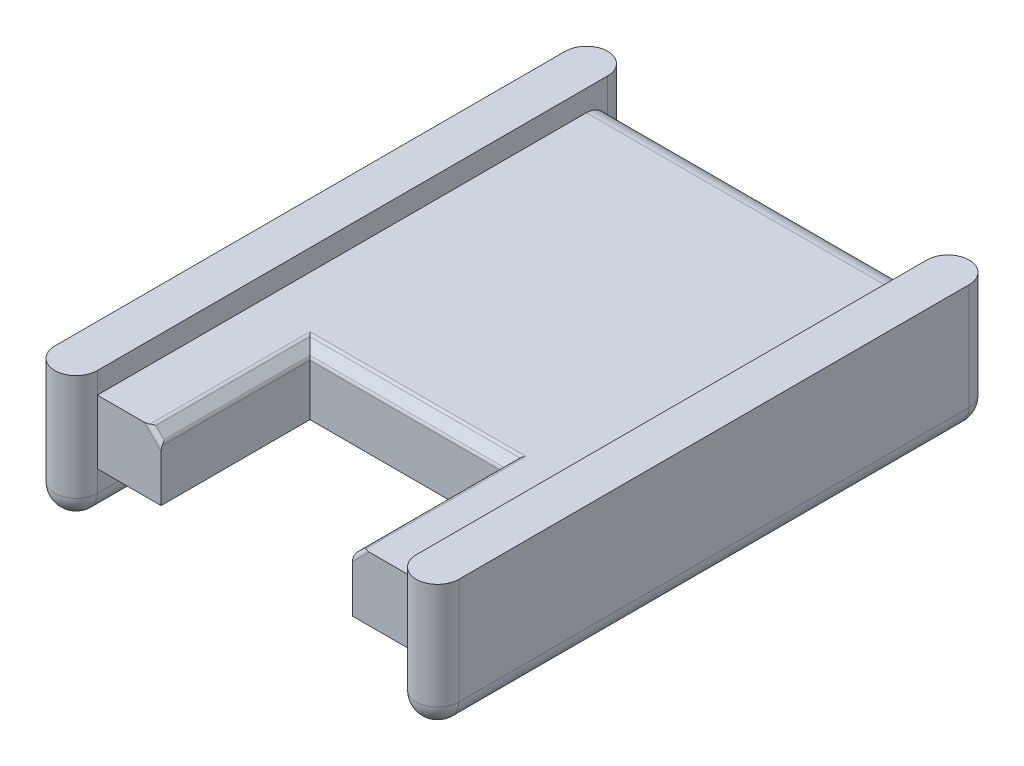
ISO-10303-21;
HEADER;
FILE_DESCRIPTION(('STEP AP214'),'2;1');
FILE_NAME('part.step','',(''),(''),'','','');
FILE_SCHEMA(('AUTOMOTIVE_DESIGN { 1 0 10303 214 1 1 1 1 }'));
ENDSEC;
DATA;
#1=APPLICATION_CONTEXT('core data for automotive mechanical design processes');
#2=APPLICATION_PROTOCOL_DEFINITION('international standard','automotive_design',2000,#1);
#3=PRODUCT_CONTEXT('',#1,'mechanical');
#4=PRODUCT('Part','Part','',(#3));
#5=PRODUCT_RELATED_PRODUCT_CATEGORY('part','',(#4));
#6=PRODUCT_DEFINITION_FORMATION('','',#4);
#7=PRODUCT_DEFINITION_CONTEXT('part definition',#1,'design');
#8=PRODUCT_DEFINITION('design','',#6,#7);
#9=PRODUCT_DEFINITION_SHAPE('','',#8);
#10=(LENGTH_UNIT() NAMED_UNIT(*) SI_UNIT(.MILLI.,.METRE.));
#11=(NAMED_UNIT(*) PLANE_ANGLE_UNIT() SI_UNIT($,.RADIAN.));
#12=(NAMED_UNIT(*) SI_UNIT($,.STERADIAN.) SOLID_ANGLE_UNIT());
#13=UNCERTAINTY_MEASURE_WITH_UNIT(LENGTH_MEASURE(1.E-05),#10,'distance_accuracy_value','');
#14=(GEOMETRIC_REPRESENTATION_CONTEXT(3) GLOBAL_UNCERTAINTY_ASSIGNED_CONTEXT((#13)) GLOBAL_UNIT_ASSIGNED_CONTEXT((#10,
#11,#12)) REPRESENTATION_CONTEXT('',''));
#15=CARTESIAN_POINT('',(0.,0.,0.));
#16=DIRECTION('',(0.,0.,1.));
#17=DIRECTION('',(1.,0.,0.));
#18=AXIS2_PLACEMENT_3D('',#15,#16,#17);
#19=CARTESIAN_POINT('',(0.,0.,0.));
#20=DIRECTION('',(0.,0.,-1.));
#21=DIRECTION('',(-1.,0.,0.));
#22=AXIS2_PLACEMENT_3D('',#19,#20,#21);
#23=PLANE('',#22);
#24=DIRECTION('',(-1.,0.,0.));
#25=VECTOR('',#24,1.);
#26=CARTESIAN_POINT('',(0.,150.,0.));
#27=LINE('',#26,#25);
#28=CARTESIAN_POINT('',(750.,150.,0.));
#29=VERTEX_POINT('',#28);
#30=CARTESIAN_POINT('',(639.142135623731,150.,0.));
#31=VERTEX_POINT('',#30);
#32=EDGE_CURVE('E405',#29,#31,#27,.T.);
#33=ORIENTED_EDGE('',*,*,#32,.T.);
#34=DIRECTION('',(-0.707106781186551,-0.707106781186544,0.));
#35=VECTOR('',#34,1.);
#36=CARTESIAN_POINT('',(607.071067811866,117.928932188135,0.));
#37=LINE('',#36,#35);
#38=CARTESIAN_POINT('',(600.,110.857864376269,0.));
#39=VERTEX_POINT('',#38);
#40=EDGE_CURVE('E303',#31,#39,#37,.T.);
#41=ORIENTED_EDGE('',*,*,#40,.T.);
#42=DIRECTION('',(0.,-1.,0.));
#43=VECTOR('',#42,1.);
#44=CARTESIAN_POINT('',(600.,0.,0.));
#45=LINE('',#44,#43);
#46=CARTESIAN_POINT('',(600.,0.,1.11022302462516E-13));
#47=VERTEX_POINT('',#46);
#48=EDGE_CURVE('E255',#39,#47,#45,.T.);
#49=ORIENTED_EDGE('',*,*,#48,.T.);
#50=DIRECTION('',(1.,0.,0.));
#51=VECTOR('',#50,1.);
#52=CARTESIAN_POINT('',(0.,0.,0.));
#53=LINE('',#52,#51);
#54=CARTESIAN_POINT('',(750.,0.,0.));
#55=VERTEX_POINT('',#54);
#56=EDGE_CURVE('E547',#47,#55,#53,.T.);
#57=ORIENTED_EDGE('',*,*,#56,.T.);
#58=DIRECTION('',(0.,1.,0.));
#59=VECTOR('',#58,1.);
#60=CARTESIAN_POINT('',(750.,0.,0.));
#61=LINE('',#60,#59);
#62=EDGE_CURVE('E410',#55,#29,#61,.T.);
#63=ORIENTED_EDGE('',*,*,#62,.T.);
#64=EDGE_LOOP('',(#33,#41,#49,#57,#63));
#65=FACE_BOUND('',#64,.T.);
#66=ADVANCED_FACE('F39',(#65),#23,.F.);
#67=CARTESIAN_POINT('',(0.,150.,-1200.));
#68=DIRECTION('',(0.,1.,0.));
#69=DIRECTION('',(0.,0.,1.));
#70=AXIS2_PLACEMENT_3D('',#67,#68,#69);
#71=PLANE('',#70);
#72=CARTESIAN_POINT('',(110.857864376269,150.,0.));
#73=VERTEX_POINT('',#72);
#74=CARTESIAN_POINT('',(0.,150.,0.));
#75=VERTEX_POINT('',#74);
#76=EDGE_CURVE('E395',#73,#75,#27,.T.);
#77=ORIENTED_EDGE('',*,*,#76,.F.);
#78=CARTESIAN_POINT('',(110.857864376269,150.,-10.));
#79=DIRECTION('',(0.,1.,0.));
#80=DIRECTION('',(1.,0.,0.));
#81=AXIS2_PLACEMENT_3D('',#78,#79,#80);
#82=ELLIPSE('',#81,14.142135623731,10.);
#83=CARTESIAN_POINT('',(120.857864376269,150.,-2.9289321881345));
#84=VERTEX_POINT('',#83);
#85=EDGE_CURVE('E284',#73,#84,#82,.T.);
#86=ORIENTED_EDGE('',*,*,#85,.T.);
#87=DIRECTION('',(0.,0.,-1.));
#88=VECTOR('',#87,1.);
#89=CARTESIAN_POINT('',(120.857864376269,150.,-1200.));
#90=LINE('',#89,#88);
#91=CARTESIAN_POINT('',(120.857864376269,150.,-379.142135623731));
#92=VERTEX_POINT('',#91);
#93=EDGE_CURVE('E272',#84,#92,#90,.T.);
#94=ORIENTED_EDGE('',*,*,#93,.T.);
#95=DIRECTION('',(1.,0.,0.));
#96=VECTOR('',#95,1.);
#97=CARTESIAN_POINT('',(0.,150.,-379.142135623731));
#98=LINE('',#97,#96);
#99=CARTESIAN_POINT('',(629.142135623731,150.,-379.142135623731));
#100=VERTEX_POINT('',#99);
#101=EDGE_CURVE('E275',#92,#100,#98,.T.);
#102=ORIENTED_EDGE('',*,*,#101,.T.);
#103=DIRECTION('',(0.,0.,1.));
#104=VECTOR('',#103,1.);
#105=CARTESIAN_POINT('',(629.142135623731,150.,-1200.));
#106=LINE('',#105,#104);
#107=CARTESIAN_POINT('',(629.142135623731,150.,-2.9289321881345));
#108=VERTEX_POINT('',#107);
#109=EDGE_CURVE('E278',#100,#108,#106,.T.);
#110=ORIENTED_EDGE('',*,*,#109,.T.);
#111=CARTESIAN_POINT('',(639.142135623731,150.,-10.));
#112=DIRECTION('',(0.,1.,0.));
#113=DIRECTION('',(1.,0.,0.));
#114=AXIS2_PLACEMENT_3D('',#111,#112,#113);
#115=ELLIPSE('',#114,14.142135623731,10.);
#116=EDGE_CURVE('E281',#108,#31,#115,.T.);
#117=ORIENTED_EDGE('',*,*,#116,.T.);
#118=ORIENTED_EDGE('',*,*,#32,.F.);
#119=DIRECTION('',(0.,0.,1.));
#120=VECTOR('',#119,1.);
#121=CARTESIAN_POINT('',(750.,150.,-1200.));
#122=LINE('',#121,#120);
#123=CARTESIAN_POINT('',(750.,150.,-1150.));
#124=VERTEX_POINT('',#123);
#125=EDGE_CURVE('E426',#124,#29,#122,.T.);
#126=ORIENTED_EDGE('',*,*,#125,.F.);
#127=DIRECTION('',(-1.,0.,0.));
#128=VECTOR('',#127,1.);
#129=CARTESIAN_POINT('',(0.,150.,-1150.));
#130=LINE('',#129,#128);
#131=CARTESIAN_POINT('',(0.,150.,-1150.));
#132=VERTEX_POINT('',#131);
#133=EDGE_CURVE('E461',#124,#132,#130,.T.);
#134=ORIENTED_EDGE('',*,*,#133,.T.);
#135=DIRECTION('',(0.,0.,1.));
#136=VECTOR('',#135,1.);
#137=CARTESIAN_POINT('',(0.,150.,-1200.));
#138=LINE('',#137,#136);
#139=EDGE_CURVE('E422',#132,#75,#138,.T.);
#140=ORIENTED_EDGE('',*,*,#139,.T.);
#141=EDGE_LOOP('',(#77,#86,#94,#102,#110,#117,#118,#126,#134,#140));
#142=FACE_BOUND('',#141,.T.);
#143=ADVANCED_FACE('F392',(#142),#71,.T.);
#144=CARTESIAN_POINT('',(0.,0.,-1200.));
#145=DIRECTION('',(0.,-1.,0.));
#146=DIRECTION('',(0.,0.,-1.));
#147=AXIS2_PLACEMENT_3D('',#144,#145,#146);
#148=PLANE('',#147);
#149=DIRECTION('',(0.,0.,1.));
#150=VECTOR('',#149,1.);
#151=CARTESIAN_POINT('',(600.,0.,-1200.));
#152=LINE('',#151,#150);
#153=CARTESIAN_POINT('',(600.,0.,-350.));
#154=VERTEX_POINT('',#153);
#155=EDGE_CURVE('E237',#154,#47,#152,.T.);
#156=ORIENTED_EDGE('',*,*,#155,.F.);
#157=DIRECTION('',(1.,0.,0.));
#158=VECTOR('',#157,1.);
#159=CARTESIAN_POINT('',(0.,0.,-350.));
#160=LINE('',#159,#158);
#161=CARTESIAN_POINT('',(150.,0.,-350.));
#162=VERTEX_POINT('',#161);
#163=EDGE_CURVE('E243',#162,#154,#160,.T.);
#164=ORIENTED_EDGE('',*,*,#163,.F.);
#165=DIRECTION('',(0.,0.,-1.));
#166=VECTOR('',#165,1.);
#167=CARTESIAN_POINT('',(150.,0.,-1200.));
#168=LINE('',#167,#166);
#169=CARTESIAN_POINT('',(150.,0.,1.66533453693773E-13));
#170=VERTEX_POINT('',#169);
#171=EDGE_CURVE('E225',#170,#162,#168,.T.);
#172=ORIENTED_EDGE('',*,*,#171,.F.);
#173=CARTESIAN_POINT('',(0.,0.,0.));
#174=VERTEX_POINT('',#173);
#175=EDGE_CURVE('E384',#174,#170,#53,.T.);
#176=ORIENTED_EDGE('',*,*,#175,.F.);
#177=DIRECTION('',(0.,0.,1.));
#178=VECTOR('',#177,1.);
#179=CARTESIAN_POINT('',(0.,0.,-1200.));
#180=LINE('',#179,#178);
#181=CARTESIAN_POINT('',(0.,0.,-1150.));
#182=VERTEX_POINT('',#181);
#183=EDGE_CURVE('E433',#182,#174,#180,.T.);
#184=ORIENTED_EDGE('',*,*,#183,.F.);
#185=DIRECTION('',(1.,0.,0.));
#186=VECTOR('',#185,1.);
#187=CARTESIAN_POINT('',(0.,0.,-1150.));
#188=LINE('',#187,#186);
#189=CARTESIAN_POINT('',(750.,0.,-1150.));
#190=VERTEX_POINT('',#189);
#191=EDGE_CURVE('E510',#182,#190,#188,.T.);
#192=ORIENTED_EDGE('',*,*,#191,.T.);
#193=DIRECTION('',(0.,0.,1.));
#194=VECTOR('',#193,1.);
#195=CARTESIAN_POINT('',(750.,0.,-1200.));
#196=LINE('',#195,#194);
#197=EDGE_CURVE('E429',#190,#55,#196,.T.);
#198=ORIENTED_EDGE('',*,*,#197,.T.);
#199=ORIENTED_EDGE('',*,*,#56,.F.);
#200=EDGE_LOOP('',(#156,#164,#172,#176,#184,#192,#198,#199));
#201=FACE_BOUND('',#200,.T.);
#202=ADVANCED_FACE('F250',(#201),#148,.T.);
#203=CARTESIAN_POINT('',(0.,0.,-1200.));
#204=DIRECTION('',(0.,0.,-1.));
#205=DIRECTION('',(-1.,0.,0.));
#206=AXIS2_PLACEMENT_3D('',#203,#204,#205);
#207=PLANE('',#206);
#208=DIRECTION('',(0.,-1.,0.));
#209=VECTOR('',#208,1.);
#210=CARTESIAN_POINT('',(0.,0.,-1200.));
#211=LINE('',#210,#209);
#212=CARTESIAN_POINT('',(0.,100.,-1200.));
#213=VERTEX_POINT('',#212);
#214=CARTESIAN_POINT('',(0.,50.,-1200.));
#215=VERTEX_POINT('',#214);
#216=EDGE_CURVE('E412',#213,#215,#211,.T.);
#217=ORIENTED_EDGE('',*,*,#216,.F.);
#218=DIRECTION('',(-1.,0.,0.));
#219=VECTOR('',#218,1.);
#220=CARTESIAN_POINT('',(0.,100.,-1200.));
#221=LINE('',#220,#219);
#222=CARTESIAN_POINT('',(750.,100.,-1200.));
#223=VERTEX_POINT('',#222);
#224=EDGE_CURVE('E506',#213,#223,#221,.F.);
#225=ORIENTED_EDGE('',*,*,#224,.T.);
#226=DIRECTION('',(0.,1.,0.));
#227=VECTOR('',#226,1.);
#228=CARTESIAN_POINT('',(750.,0.,-1200.));
#229=LINE('',#228,#227);
#230=CARTESIAN_POINT('',(750.,50.,-1200.));
#231=VERTEX_POINT('',#230);
#232=EDGE_CURVE('E417',#231,#223,#229,.T.);
#233=ORIENTED_EDGE('',*,*,#232,.F.);
#234=DIRECTION('',(1.,0.,0.));
#235=VECTOR('',#234,1.);
#236=CARTESIAN_POINT('',(0.,50.,-1200.));
#237=LINE('',#236,#235);
#238=EDGE_CURVE('E502',#231,#215,#237,.F.);
#239=ORIENTED_EDGE('',*,*,#238,.T.);
#240=EDGE_LOOP('',(#217,#225,#233,#239));
#241=FACE_BOUND('',#240,.T.);
#242=ADVANCED_FACE('F636',(#241),#207,.T.);
#243=DIRECTION('',(0.,1.,0.));
#244=VECTOR('',#243,1.);
#245=CARTESIAN_POINT('',(150.,0.,0.));
#246=LINE('',#245,#244);
#247=CARTESIAN_POINT('',(150.,110.857864376269,0.));
#248=VERTEX_POINT('',#247);
#249=EDGE_CURVE('E231',#170,#248,#246,.T.);
#250=ORIENTED_EDGE('',*,*,#249,.T.);
#251=DIRECTION('',(-0.707106781186551,0.707106781186544,0.));
#252=VECTOR('',#251,1.);
#253=CARTESIAN_POINT('',(117.928932188134,142.928932188134,0.));
#254=LINE('',#253,#252);
#255=EDGE_CURVE('E268',#248,#73,#254,.T.);
#256=ORIENTED_EDGE('',*,*,#255,.T.);
#257=ORIENTED_EDGE('',*,*,#76,.T.);
#258=DIRECTION('',(0.,-1.,0.));
#259=VECTOR('',#258,1.);
#260=CARTESIAN_POINT('',(0.,0.,0.));
#261=LINE('',#260,#259);
#262=EDGE_CURVE('E549',#75,#174,#261,.T.);
#263=ORIENTED_EDGE('',*,*,#262,.T.);
#264=ORIENTED_EDGE('',*,*,#175,.T.);
#265=EDGE_LOOP('',(#250,#256,#257,#263,#264));
#266=FACE_BOUND('',#265,.T.);
#267=ADVANCED_FACE('F381',(#266),#23,.F.);
#268=CARTESIAN_POINT('',(0.,200.,-1200.));
#269=DIRECTION('',(-1.,0.,0.));
#270=DIRECTION('',(0.,0.,1.));
#271=AXIS2_PLACEMENT_3D('',#268,#269,#270);
#272=PLANE('',#271);
#273=ORIENTED_EDGE('',*,*,#139,.F.);
#274=CARTESIAN_POINT('',(0.,100.,-1150.));
#275=DIRECTION('',(-1.,0.,0.));
#276=DIRECTION('',(0.,0.,1.));
#277=AXIS2_PLACEMENT_3D('',#274,#275,#276);
#278=CIRCLE('',#277,50.);
#279=EDGE_CURVE('E514',#132,#213,#278,.T.);
#280=ORIENTED_EDGE('',*,*,#279,.T.);
#281=DIRECTION('',(0.,-1.,0.));
#282=VECTOR('',#281,1.);
#283=CARTESIAN_POINT('',(0.,200.,-1200.));
#284=LINE('',#283,#282);
#285=CARTESIAN_POINT('',(0.,200.,-1200.));
#286=VERTEX_POINT('',#285);
#287=EDGE_CURVE('E570',#286,#213,#284,.T.);
#288=ORIENTED_EDGE('',*,*,#287,.F.);
#289=DIRECTION('',(0.,0.,-1.));
#290=VECTOR('',#289,1.);
#291=CARTESIAN_POINT('',(0.,200.,-1200.));
#292=LINE('',#291,#290);
#293=CARTESIAN_POINT('',(0.,200.,0.));
#294=VERTEX_POINT('',#293);
#295=EDGE_CURVE('E573',#294,#286,#292,.T.);
#296=ORIENTED_EDGE('',*,*,#295,.F.);
#297=DIRECTION('',(0.,-1.,0.));
#298=VECTOR('',#297,1.);
#299=CARTESIAN_POINT('',(0.,200.,0.));
#300=LINE('',#299,#298);
#301=EDGE_CURVE('E565',#294,#75,#300,.T.);
#302=ORIENTED_EDGE('',*,*,#301,.T.);
#303=EDGE_LOOP('',(#273,#280,#288,#296,#302));
#304=FACE_BOUND('',#303,.T.);
#305=ADVANCED_FACE('F635',(#304),#272,.F.);
#306=CARTESIAN_POINT('',(-50.,200.,-1200.));
#307=DIRECTION('',(0.,-1.,0.));
#308=DIRECTION('',(0.,0.,-1.));
#309=AXIS2_PLACEMENT_3D('',#306,#307,#308);
#310=CYLINDRICAL_SURFACE('',#309,50.);
#311=CARTESIAN_POINT('',(0.,-50.,-1200.));
#312=VERTEX_POINT('',#311);
#313=EDGE_CURVE('E533',#215,#312,#284,.T.);
#314=ORIENTED_EDGE('',*,*,#313,.T.);
#315=CARTESIAN_POINT('',(-50.,-50.,-1200.));
#316=DIRECTION('',(0.,-1.,0.));
#317=DIRECTION('',(0.,0.,-1.));
#318=AXIS2_PLACEMENT_3D('',#315,#316,#317);
#319=CIRCLE('',#318,50.);
#320=CARTESIAN_POINT('',(-100.,-50.,-1200.));
#321=VERTEX_POINT('',#320);
#322=EDGE_CURVE('E458',#312,#321,#319,.F.);
#323=ORIENTED_EDGE('',*,*,#322,.T.);
#324=DIRECTION('',(0.,-1.,0.));
#325=VECTOR('',#324,1.);
#326=CARTESIAN_POINT('',(-100.,200.,-1200.));
#327=LINE('',#326,#325);
#328=CARTESIAN_POINT('',(-100.,200.,-1200.));
#329=VERTEX_POINT('',#328);
#330=EDGE_CURVE('E552',#329,#321,#327,.T.);
#331=ORIENTED_EDGE('',*,*,#330,.F.);
#332=CARTESIAN_POINT('',(-50.,200.,-1200.));
#333=DIRECTION('',(0.,1.,0.));
#334=DIRECTION('',(0.,0.,1.));
#335=AXIS2_PLACEMENT_3D('',#332,#333,#334);
#336=CIRCLE('',#335,50.);
#337=EDGE_CURVE('E582',#286,#329,#336,.T.);
#338=ORIENTED_EDGE('',*,*,#337,.F.);
#339=ORIENTED_EDGE('',*,*,#287,.T.);
#340=ORIENTED_EDGE('',*,*,#216,.T.);
#341=EDGE_LOOP('',(#314,#323,#331,#338,#339,#340));
#342=FACE_BOUND('',#341,.T.);
#343=ADVANCED_FACE('F640',(#342),#310,.T.);
#344=CARTESIAN_POINT('',(-100.,200.,-1200.));
#345=DIRECTION('',(1.,0.,0.));
#346=DIRECTION('',(0.,0.,-1.));
#347=AXIS2_PLACEMENT_3D('',#344,#345,#346);
#348=PLANE('',#347);
#349=ORIENTED_EDGE('',*,*,#330,.T.);
#350=DIRECTION('',(0.,0.,1.));
#351=VECTOR('',#350,1.);
#352=CARTESIAN_POINT('',(-100.,-50.,-1200.));
#353=LINE('',#352,#351);
#354=CARTESIAN_POINT('',(-99.9999999999999,-50.,0.));
#355=VERTEX_POINT('',#354);
#356=EDGE_CURVE('E448',#321,#355,#353,.T.);
#357=ORIENTED_EDGE('',*,*,#356,.T.);
#358=DIRECTION('',(0.,-1.,0.));
#359=VECTOR('',#358,1.);
#360=CARTESIAN_POINT('',(-99.9999999999999,200.,0.));
#361=LINE('',#360,#359);
#362=CARTESIAN_POINT('',(-99.9999999999999,200.,0.));
#363=VERTEX_POINT('',#362);
#364=EDGE_CURVE('E561',#363,#355,#361,.T.);
#365=ORIENTED_EDGE('',*,*,#364,.F.);
#366=DIRECTION('',(0.,0.,1.));
#367=VECTOR('',#366,1.);
#368=CARTESIAN_POINT('',(-100.,200.,-1200.));
#369=LINE('',#368,#367);
#370=EDGE_CURVE('E579',#329,#363,#369,.T.);
#371=ORIENTED_EDGE('',*,*,#370,.F.);
#372=EDGE_LOOP('',(#349,#357,#365,#371));
#373=FACE_BOUND('',#372,.T.);
#374=ADVANCED_FACE('F653',(#373),#348,.F.);
#375=CARTESIAN_POINT('',(-49.9999999999999,200.,0.));
#376=DIRECTION('',(0.,-1.,0.));
#377=DIRECTION('',(0.,0.,-1.));
#378=AXIS2_PLACEMENT_3D('',#375,#376,#377);
#379=CYLINDRICAL_SURFACE('',#378,49.9999999999999);
#380=ORIENTED_EDGE('',*,*,#364,.T.);
#381=CARTESIAN_POINT('',(-49.9999999999999,-50.,0.));
#382=DIRECTION('',(0.,-1.,0.));
#383=DIRECTION('',(0.,0.,-1.));
#384=AXIS2_PLACEMENT_3D('',#381,#382,#383);
#385=CIRCLE('',#384,49.9999999999999);
#386=CARTESIAN_POINT('',(0.,-50.,0.));
#387=VERTEX_POINT('',#386);
#388=EDGE_CURVE('E452',#355,#387,#385,.F.);
#389=ORIENTED_EDGE('',*,*,#388,.T.);
#390=EDGE_CURVE('E569',#174,#387,#300,.T.);
#391=ORIENTED_EDGE('',*,*,#390,.F.);
#392=ORIENTED_EDGE('',*,*,#262,.F.);
#393=ORIENTED_EDGE('',*,*,#301,.F.);
#394=CARTESIAN_POINT('',(-49.9999999999999,200.,0.));
#395=DIRECTION('',(0.,1.,0.));
#396=DIRECTION('',(0.,0.,1.));
#397=AXIS2_PLACEMENT_3D('',#394,#395,#396);
#398=CIRCLE('',#397,49.9999999999999);
#399=EDGE_CURVE('E576',#363,#294,#398,.T.);
#400=ORIENTED_EDGE('',*,*,#399,.F.);
#401=EDGE_LOOP('',(#380,#389,#391,#392,#393,#400));
#402=FACE_BOUND('',#401,.T.);
#403=ADVANCED_FACE('F657',(#402),#379,.T.);
#404=ORIENTED_EDGE('',*,*,#390,.T.);
#405=DIRECTION('',(0.,0.,-1.));
#406=VECTOR('',#405,1.);
#407=CARTESIAN_POINT('',(0.,-50.,-1200.));
#408=LINE('',#407,#406);
#409=EDGE_CURVE('E455',#387,#312,#408,.T.);
#410=ORIENTED_EDGE('',*,*,#409,.T.);
#411=ORIENTED_EDGE('',*,*,#313,.F.);
#412=CARTESIAN_POINT('',(0.,50.,-1150.));
#413=DIRECTION('',(-1.,0.,0.));
#414=DIRECTION('',(0.,0.,1.));
#415=AXIS2_PLACEMENT_3D('',#412,#413,#414);
#416=CIRCLE('',#415,50.);
#417=EDGE_CURVE('E386',#215,#182,#416,.T.);
#418=ORIENTED_EDGE('',*,*,#417,.T.);
#419=ORIENTED_EDGE('',*,*,#183,.T.);
#420=EDGE_LOOP('',(#404,#410,#411,#418,#419));
#421=FACE_BOUND('',#420,.T.);
#422=ADVANCED_FACE('F530',(#421),#272,.F.);
#423=CARTESIAN_POINT('',(-50.,200.,-1200.));
#424=DIRECTION('',(0.,1.,0.));
#425=DIRECTION('',(0.,0.,1.));
#426=AXIS2_PLACEMENT_3D('',#423,#424,#425);
#427=PLANE('',#426);
#428=ORIENTED_EDGE('',*,*,#337,.T.);
#429=ORIENTED_EDGE('',*,*,#370,.T.);
#430=ORIENTED_EDGE('',*,*,#399,.T.);
#431=ORIENTED_EDGE('',*,*,#295,.T.);
#432=EDGE_LOOP('',(#428,#429,#430,#431));
#433=FACE_BOUND('',#432,.T.);
#434=ADVANCED_FACE('F663',(#433),#427,.T.);
#435=CARTESIAN_POINT('',(750.,200.,-1200.));
#436=DIRECTION('',(1.,0.,0.));
#437=DIRECTION('',(0.,0.,-1.));
#438=AXIS2_PLACEMENT_3D('',#435,#436,#437);
#439=PLANE('',#438);
#440=DIRECTION('',(0.,-1.,0.));
#441=VECTOR('',#440,1.);
#442=CARTESIAN_POINT('',(750.,200.,-1200.));
#443=LINE('',#442,#441);
#444=CARTESIAN_POINT('',(750.,200.,-1200.));
#445=VERTEX_POINT('',#444);
#446=EDGE_CURVE('E594',#445,#223,#443,.T.);
#447=ORIENTED_EDGE('',*,*,#446,.T.);
#448=CARTESIAN_POINT('',(750.,100.,-1150.));
#449=DIRECTION('',(1.,0.,0.));
#450=DIRECTION('',(0.,0.,-1.));
#451=AXIS2_PLACEMENT_3D('',#448,#449,#450);
#452=CIRCLE('',#451,50.);
#453=EDGE_CURVE('E518',#223,#124,#452,.T.);
#454=ORIENTED_EDGE('',*,*,#453,.T.);
#455=ORIENTED_EDGE('',*,*,#125,.T.);
#456=DIRECTION('',(0.,-1.,0.));
#457=VECTOR('',#456,1.);
#458=CARTESIAN_POINT('',(750.,200.,0.));
#459=LINE('',#458,#457);
#460=CARTESIAN_POINT('',(750.,200.,0.));
#461=VERTEX_POINT('',#460);
#462=EDGE_CURVE('E597',#461,#29,#459,.T.);
#463=ORIENTED_EDGE('',*,*,#462,.F.);
#464=DIRECTION('',(0.,0.,1.));
#465=VECTOR('',#464,1.);
#466=CARTESIAN_POINT('',(750.,200.,-1200.));
#467=LINE('',#466,#465);
#468=EDGE_CURVE('E601',#445,#461,#467,.T.);
#469=ORIENTED_EDGE('',*,*,#468,.F.);
#470=EDGE_LOOP('',(#447,#454,#455,#463,#469));
#471=FACE_BOUND('',#470,.T.);
#472=ADVANCED_FACE('F666',(#471),#439,.F.);
#473=CARTESIAN_POINT('',(800.,200.,0.));
#474=DIRECTION('',(0.,-1.,0.));
#475=DIRECTION('',(0.,0.,-1.));
#476=AXIS2_PLACEMENT_3D('',#473,#474,#475);
#477=CYLINDRICAL_SURFACE('',#476,49.9999999999999);
#478=CARTESIAN_POINT('',(750.,-50.,0.));
#479=VERTEX_POINT('',#478);
#480=EDGE_CURVE('E546',#55,#479,#459,.T.);
#481=ORIENTED_EDGE('',*,*,#480,.T.);
#482=CARTESIAN_POINT('',(800.,-50.,0.));
#483=DIRECTION('',(0.,-1.,0.));
#484=DIRECTION('',(0.,0.,-1.));
#485=AXIS2_PLACEMENT_3D('',#482,#483,#484);
#486=CIRCLE('',#485,49.9999999999999);
#487=CARTESIAN_POINT('',(850.,-50.,0.));
#488=VERTEX_POINT('',#487);
#489=EDGE_CURVE('E445',#479,#488,#486,.F.);
#490=ORIENTED_EDGE('',*,*,#489,.T.);
#491=DIRECTION('',(0.,-1.,0.));
#492=VECTOR('',#491,1.);
#493=CARTESIAN_POINT('',(850.,200.,0.));
#494=LINE('',#493,#492);
#495=CARTESIAN_POINT('',(850.,200.,0.));
#496=VERTEX_POINT('',#495);
#497=EDGE_CURVE('E586',#496,#488,#494,.T.);
#498=ORIENTED_EDGE('',*,*,#497,.F.);
#499=CARTESIAN_POINT('',(800.,200.,0.));
#500=DIRECTION('',(0.,1.,0.));
#501=DIRECTION('',(0.,0.,1.));
#502=AXIS2_PLACEMENT_3D('',#499,#500,#501);
#503=CIRCLE('',#502,49.9999999999999);
#504=EDGE_CURVE('E481',#461,#496,#503,.T.);
#505=ORIENTED_EDGE('',*,*,#504,.F.);
#506=ORIENTED_EDGE('',*,*,#462,.T.);
#507=ORIENTED_EDGE('',*,*,#62,.F.);
#508=EDGE_LOOP('',(#481,#490,#498,#505,#506,#507));
#509=FACE_BOUND('',#508,.T.);
#510=ADVANCED_FACE('F668',(#509),#477,.T.);
#511=CARTESIAN_POINT('',(850.,200.,-1200.));
#512=DIRECTION('',(-1.,0.,0.));
#513=DIRECTION('',(0.,0.,1.));
#514=AXIS2_PLACEMENT_3D('',#511,#512,#513);
#515=PLANE('',#514);
#516=ORIENTED_EDGE('',*,*,#497,.T.);
#517=DIRECTION('',(0.,0.,-1.));
#518=VECTOR('',#517,1.);
#519=CARTESIAN_POINT('',(850.,-50.,-1200.));
#520=LINE('',#519,#518);
#521=CARTESIAN_POINT('',(850.,-50.,-1200.));
#522=VERTEX_POINT('',#521);
#523=EDGE_CURVE('E425',#488,#522,#520,.T.);
#524=ORIENTED_EDGE('',*,*,#523,.T.);
#525=DIRECTION('',(0.,-1.,0.));
#526=VECTOR('',#525,1.);
#527=CARTESIAN_POINT('',(850.,200.,-1200.));
#528=LINE('',#527,#526);
#529=CARTESIAN_POINT('',(850.,200.,-1200.));
#530=VERTEX_POINT('',#529);
#531=EDGE_CURVE('E590',#530,#522,#528,.T.);
#532=ORIENTED_EDGE('',*,*,#531,.F.);
#533=DIRECTION('',(0.,0.,-1.));
#534=VECTOR('',#533,1.);
#535=CARTESIAN_POINT('',(850.,200.,-1200.));
#536=LINE('',#535,#534);
#537=EDGE_CURVE('E607',#496,#530,#536,.T.);
#538=ORIENTED_EDGE('',*,*,#537,.F.);
#539=EDGE_LOOP('',(#516,#524,#532,#538));
#540=FACE_BOUND('',#539,.T.);
#541=ADVANCED_FACE('F671',(#540),#515,.F.);
#542=CARTESIAN_POINT('',(800.,200.,-1200.));
#543=DIRECTION('',(0.,-1.,0.));
#544=DIRECTION('',(0.,0.,-1.));
#545=AXIS2_PLACEMENT_3D('',#542,#543,#544);
#546=CYLINDRICAL_SURFACE('',#545,50.);
#547=ORIENTED_EDGE('',*,*,#531,.T.);
#548=CARTESIAN_POINT('',(800.,-50.,-1200.));
#549=DIRECTION('',(0.,-1.,0.));
#550=DIRECTION('',(0.,0.,-1.));
#551=AXIS2_PLACEMENT_3D('',#548,#549,#550);
#552=CIRCLE('',#551,50.);
#553=CARTESIAN_POINT('',(750.,-50.,-1200.));
#554=VERTEX_POINT('',#553);
#555=EDGE_CURVE('E439',#522,#554,#552,.F.);
#556=ORIENTED_EDGE('',*,*,#555,.T.);
#557=EDGE_CURVE('E542',#231,#554,#443,.T.);
#558=ORIENTED_EDGE('',*,*,#557,.F.);
#559=ORIENTED_EDGE('',*,*,#232,.T.);
#560=ORIENTED_EDGE('',*,*,#446,.F.);
#561=CARTESIAN_POINT('',(800.,200.,-1200.));
#562=DIRECTION('',(0.,1.,0.));
#563=DIRECTION('',(0.,0.,1.));
#564=AXIS2_PLACEMENT_3D('',#561,#562,#563);
#565=CIRCLE('',#564,50.);
#566=EDGE_CURVE('E604',#530,#445,#565,.T.);
#567=ORIENTED_EDGE('',*,*,#566,.F.);
#568=EDGE_LOOP('',(#547,#556,#558,#559,#560,#567));
#569=FACE_BOUND('',#568,.T.);
#570=ADVANCED_FACE('F675',(#569),#546,.T.);
#571=ORIENTED_EDGE('',*,*,#557,.T.);
#572=DIRECTION('',(0.,0.,1.));
#573=VECTOR('',#572,1.);
#574=CARTESIAN_POINT('',(750.,-50.,-1200.));
#575=LINE('',#574,#573);
#576=EDGE_CURVE('E442',#554,#479,#575,.T.);
#577=ORIENTED_EDGE('',*,*,#576,.T.);
#578=ORIENTED_EDGE('',*,*,#480,.F.);
#579=ORIENTED_EDGE('',*,*,#197,.F.);
#580=CARTESIAN_POINT('',(750.,50.,-1150.));
#581=DIRECTION('',(1.,0.,0.));
#582=DIRECTION('',(0.,0.,-1.));
#583=AXIS2_PLACEMENT_3D('',#580,#581,#582);
#584=CIRCLE('',#583,50.);
#585=EDGE_CURVE('E521',#190,#231,#584,.T.);
#586=ORIENTED_EDGE('',*,*,#585,.T.);
#587=EDGE_LOOP('',(#571,#577,#578,#579,#586));
#588=FACE_BOUND('',#587,.T.);
#589=ADVANCED_FACE('F541',(#588),#439,.F.);
#590=CARTESIAN_POINT('',(800.,200.,0.));
#591=DIRECTION('',(0.,1.,0.));
#592=DIRECTION('',(0.,0.,1.));
#593=AXIS2_PLACEMENT_3D('',#590,#591,#592);
#594=PLANE('',#593);
#595=ORIENTED_EDGE('',*,*,#504,.T.);
#596=ORIENTED_EDGE('',*,*,#537,.T.);
#597=ORIENTED_EDGE('',*,*,#566,.T.);
#598=ORIENTED_EDGE('',*,*,#468,.T.);
#599=EDGE_LOOP('',(#595,#596,#597,#598));
#600=FACE_BOUND('',#599,.T.);
#601=ADVANCED_FACE('F682',(#600),#594,.T.);
#602=CARTESIAN_POINT('',(800.,-50.,-1200.));
#603=DIRECTION('',(0.,0.,1.));
#604=DIRECTION('',(1.,0.,0.));
#605=AXIS2_PLACEMENT_3D('',#602,#603,#604);
#606=CYLINDRICAL_SURFACE('',#605,50.);
#607=CARTESIAN_POINT('',(800.,-50.,0.));
#608=DIRECTION('',(0.,0.,1.));
#609=DIRECTION('',(1.,0.,0.));
#610=AXIS2_PLACEMENT_3D('',#607,#608,#609);
#611=CIRCLE('',#610,50.);
#612=CARTESIAN_POINT('',(800.,-100.,0.));
#613=VERTEX_POINT('',#612);
#614=EDGE_CURVE('E478',#479,#613,#611,.T.);
#615=ORIENTED_EDGE('',*,*,#614,.F.);
#616=ORIENTED_EDGE('',*,*,#576,.F.);
#617=CARTESIAN_POINT('',(800.,-50.,-1200.));
#618=DIRECTION('',(0.,0.,-1.));
#619=DIRECTION('',(-1.,0.,0.));
#620=AXIS2_PLACEMENT_3D('',#617,#618,#619);
#621=CIRCLE('',#620,50.);
#622=CARTESIAN_POINT('',(800.,-100.,-1200.));
#623=VERTEX_POINT('',#622);
#624=EDGE_CURVE('E474',#623,#554,#621,.T.);
#625=ORIENTED_EDGE('',*,*,#624,.F.);
#626=DIRECTION('',(0.,0.,1.));
#627=VECTOR('',#626,1.);
#628=CARTESIAN_POINT('',(800.,-100.,0.));
#629=LINE('',#628,#627);
#630=EDGE_CURVE('E470',#613,#623,#629,.F.);
#631=ORIENTED_EDGE('',*,*,#630,.F.);
#632=EDGE_LOOP('',(#615,#616,#625,#631));
#633=FACE_BOUND('',#632,.T.);
#634=ADVANCED_FACE('F684',(#633),#606,.T.);
#635=CARTESIAN_POINT('',(800.,-50.,0.));
#636=DIRECTION('',(0.,1.,0.));
#637=DIRECTION('',(0.,0.,1.));
#638=AXIS2_PLACEMENT_3D('',#635,#636,#637);
#639=SPHERICAL_SURFACE('',#638,50.);
#640=ORIENTED_EDGE('',*,*,#489,.F.);
#641=ORIENTED_EDGE('',*,*,#614,.T.);
#642=CARTESIAN_POINT('',(800.,-50.,0.));
#643=DIRECTION('',(0.,0.,-1.));
#644=DIRECTION('',(-1.,0.,0.));
#645=AXIS2_PLACEMENT_3D('',#642,#643,#644);
#646=CIRCLE('',#645,50.);
#647=EDGE_CURVE('E465',#488,#613,#646,.T.);
#648=ORIENTED_EDGE('',*,*,#647,.F.);
#649=EDGE_LOOP('',(#640,#641,#648));
#650=FACE_BOUND('',#649,.T.);
#651=ADVANCED_FACE('F689',(#650),#639,.T.);
#652=CARTESIAN_POINT('',(800.,-50.,-1200.));
#653=DIRECTION('',(0.,1.,0.));
#654=DIRECTION('',(0.,0.,1.));
#655=AXIS2_PLACEMENT_3D('',#652,#653,#654);
#656=SPHERICAL_SURFACE('',#655,50.);
#657=ORIENTED_EDGE('',*,*,#624,.T.);
#658=ORIENTED_EDGE('',*,*,#555,.F.);
#659=CARTESIAN_POINT('',(800.,-50.,-1200.));
#660=DIRECTION('',(0.,0.,1.));
#661=DIRECTION('',(1.,0.,0.));
#662=AXIS2_PLACEMENT_3D('',#659,#660,#661);
#663=CIRCLE('',#662,50.);
#664=EDGE_CURVE('E462',#623,#522,#663,.T.);
#665=ORIENTED_EDGE('',*,*,#664,.F.);
#666=EDGE_LOOP('',(#657,#658,#665));
#667=FACE_BOUND('',#666,.T.);
#668=ADVANCED_FACE('F708',(#667),#656,.T.);
#669=CARTESIAN_POINT('',(800.,-50.,-1200.));
#670=DIRECTION('',(0.,0.,-1.));
#671=DIRECTION('',(-1.,0.,0.));
#672=AXIS2_PLACEMENT_3D('',#669,#670,#671);
#673=CYLINDRICAL_SURFACE('',#672,50.);
#674=ORIENTED_EDGE('',*,*,#647,.T.);
#675=ORIENTED_EDGE('',*,*,#630,.T.);
#676=ORIENTED_EDGE('',*,*,#664,.T.);
#677=ORIENTED_EDGE('',*,*,#523,.F.);
#678=EDGE_LOOP('',(#674,#675,#676,#677));
#679=FACE_BOUND('',#678,.T.);
#680=ADVANCED_FACE('F704',(#679),#673,.T.);
#681=CARTESIAN_POINT('',(-50.,-50.,-1200.));
#682=DIRECTION('',(0.,0.,-1.));
#683=DIRECTION('',(-1.,0.,0.));
#684=AXIS2_PLACEMENT_3D('',#681,#682,#683);
#685=CYLINDRICAL_SURFACE('',#684,50.);
#686=CARTESIAN_POINT('',(-50.,-50.,-1200.));
#687=DIRECTION('',(0.,0.,-1.));
#688=DIRECTION('',(-1.,0.,0.));
#689=AXIS2_PLACEMENT_3D('',#686,#687,#688);
#690=CIRCLE('',#689,50.);
#691=CARTESIAN_POINT('',(-50.,-100.,-1200.));
#692=VERTEX_POINT('',#691);
#693=EDGE_CURVE('E466',#312,#692,#690,.T.);
#694=ORIENTED_EDGE('',*,*,#693,.F.);
#695=ORIENTED_EDGE('',*,*,#409,.F.);
#696=CARTESIAN_POINT('',(-50.,-50.,0.));
#697=DIRECTION('',(0.,0.,1.));
#698=DIRECTION('',(1.,0.,0.));
#699=AXIS2_PLACEMENT_3D('',#696,#697,#698);
#700=CIRCLE('',#699,50.);
#701=CARTESIAN_POINT('',(-49.9999999999999,-100.,0.));
#702=VERTEX_POINT('',#701);
#703=EDGE_CURVE('E493',#702,#387,#700,.T.);
#704=ORIENTED_EDGE('',*,*,#703,.F.);
#705=DIRECTION('',(0.,0.,-1.));
#706=VECTOR('',#705,1.);
#707=CARTESIAN_POINT('',(-50.,-100.,-1200.));
#708=LINE('',#707,#706);
#709=EDGE_CURVE('E489',#692,#702,#708,.F.);
#710=ORIENTED_EDGE('',*,*,#709,.F.);
#711=EDGE_LOOP('',(#694,#695,#704,#710));
#712=FACE_BOUND('',#711,.T.);
#713=ADVANCED_FACE('F723',(#712),#685,.T.);
#714=CARTESIAN_POINT('',(-50.,-50.,-1200.));
#715=DIRECTION('',(0.,1.,0.));
#716=DIRECTION('',(0.,0.,1.));
#717=AXIS2_PLACEMENT_3D('',#714,#715,#716);
#718=SPHERICAL_SURFACE('',#717,50.);
#719=ORIENTED_EDGE('',*,*,#322,.F.);
#720=ORIENTED_EDGE('',*,*,#693,.T.);
#721=CARTESIAN_POINT('',(-50.,-50.,-1200.));
#722=DIRECTION('',(0.,0.,1.));
#723=DIRECTION('',(1.,0.,0.));
#724=AXIS2_PLACEMENT_3D('',#721,#722,#723);
#725=CIRCLE('',#724,50.);
#726=EDGE_CURVE('E485',#321,#692,#725,.T.);
#727=ORIENTED_EDGE('',*,*,#726,.F.);
#728=EDGE_LOOP('',(#719,#720,#727));
#729=FACE_BOUND('',#728,.T.);
#730=ADVANCED_FACE('F735',(#729),#718,.T.);
#731=CARTESIAN_POINT('',(-49.9999999999999,-50.,0.));
#732=DIRECTION('',(0.,1.,0.));
#733=DIRECTION('',(0.,0.,1.));
#734=AXIS2_PLACEMENT_3D('',#731,#732,#733);
#735=SPHERICAL_SURFACE('',#734,50.);
#736=ORIENTED_EDGE('',*,*,#703,.T.);
#737=ORIENTED_EDGE('',*,*,#388,.F.);
#738=CARTESIAN_POINT('',(-49.9999999999999,-50.,0.));
#739=DIRECTION('',(0.,0.,-1.));
#740=DIRECTION('',(-1.,0.,0.));
#741=AXIS2_PLACEMENT_3D('',#738,#739,#740);
#742=CIRCLE('',#741,50.);
#743=EDGE_CURVE('E482',#702,#355,#742,.T.);
#744=ORIENTED_EDGE('',*,*,#743,.F.);
#745=EDGE_LOOP('',(#736,#737,#744));
#746=FACE_BOUND('',#745,.T.);
#747=ADVANCED_FACE('F729',(#746),#735,.T.);
#748=CARTESIAN_POINT('',(-50.,-50.,-1200.));
#749=DIRECTION('',(0.,0.,1.));
#750=DIRECTION('',(1.,0.,0.));
#751=AXIS2_PLACEMENT_3D('',#748,#749,#750);
#752=CYLINDRICAL_SURFACE('',#751,50.);
#753=ORIENTED_EDGE('',*,*,#726,.T.);
#754=ORIENTED_EDGE('',*,*,#709,.T.);
#755=ORIENTED_EDGE('',*,*,#743,.T.);
#756=ORIENTED_EDGE('',*,*,#356,.F.);
#757=EDGE_LOOP('',(#753,#754,#755,#756));
#758=FACE_BOUND('',#757,.T.);
#759=ADVANCED_FACE('F732',(#758),#752,.T.);
#760=CARTESIAN_POINT('',(0.,100.,-1150.));
#761=DIRECTION('',(-1.,0.,0.));
#762=DIRECTION('',(0.,0.,1.));
#763=AXIS2_PLACEMENT_3D('',#760,#761,#762);
#764=CYLINDRICAL_SURFACE('',#763,50.);
#765=ORIENTED_EDGE('',*,*,#453,.F.);
#766=ORIENTED_EDGE('',*,*,#224,.F.);
#767=ORIENTED_EDGE('',*,*,#279,.F.);
#768=ORIENTED_EDGE('',*,*,#133,.F.);
#769=EDGE_LOOP('',(#765,#766,#767,#768));
#770=FACE_BOUND('',#769,.T.);
#771=ADVANCED_FACE('F746',(#770),#764,.T.);
#772=CARTESIAN_POINT('',(0.,50.,-1150.));
#773=DIRECTION('',(1.,0.,0.));
#774=DIRECTION('',(0.,0.,-1.));
#775=AXIS2_PLACEMENT_3D('',#772,#773,#774);
#776=CYLINDRICAL_SURFACE('',#775,50.);
#777=ORIENTED_EDGE('',*,*,#417,.F.);
#778=ORIENTED_EDGE('',*,*,#238,.F.);
#779=ORIENTED_EDGE('',*,*,#585,.F.);
#780=ORIENTED_EDGE('',*,*,#191,.F.);
#781=EDGE_LOOP('',(#777,#778,#779,#780));
#782=FACE_BOUND('',#781,.T.);
#783=ADVANCED_FACE('F538',(#782),#776,.T.);
#784=CARTESIAN_POINT('',(600.,-100.,-350.));
#785=DIRECTION('',(0.,0.,-1.));
#786=DIRECTION('',(-1.,0.,0.));
#787=AXIS2_PLACEMENT_3D('',#784,#785,#786);
#788=PLANE('',#787);
#789=DIRECTION('',(0.,1.,0.));
#790=VECTOR('',#789,1.);
#791=CARTESIAN_POINT('',(600.,-100.,-350.));
#792=LINE('',#791,#790);
#793=CARTESIAN_POINT('',(600.,120.857864376269,-350.));
#794=VERTEX_POINT('',#793);
#795=EDGE_CURVE('E238',#154,#794,#792,.T.);
#796=ORIENTED_EDGE('',*,*,#795,.T.);
#797=DIRECTION('',(-1.,0.,0.));
#798=VECTOR('',#797,1.);
#799=CARTESIAN_POINT('',(150.,120.857864376269,-350.));
#800=LINE('',#799,#798);
#801=CARTESIAN_POINT('',(150.,120.857864376269,-350.));
#802=VERTEX_POINT('',#801);
#803=EDGE_CURVE('E246',#794,#802,#800,.T.);
#804=ORIENTED_EDGE('',*,*,#803,.T.);
#805=DIRECTION('',(0.,1.,0.));
#806=VECTOR('',#805,1.);
#807=CARTESIAN_POINT('',(150.,-100.,-350.));
#808=LINE('',#807,#806);
#809=EDGE_CURVE('E228',#162,#802,#808,.T.);
#810=ORIENTED_EDGE('',*,*,#809,.F.);
#811=ORIENTED_EDGE('',*,*,#163,.T.);
#812=EDGE_LOOP('',(#796,#804,#810,#811));
#813=FACE_BOUND('',#812,.T.);
#814=ADVANCED_FACE('F242',(#813),#788,.F.);
#815=CARTESIAN_POINT('',(600.,-100.,1.11022302462516E-13));
#816=DIRECTION('',(1.,0.,0.));
#817=DIRECTION('',(0.,0.,-1.));
#818=AXIS2_PLACEMENT_3D('',#815,#816,#817);
#819=PLANE('',#818);
#820=ORIENTED_EDGE('',*,*,#48,.F.);
#821=CARTESIAN_POINT('',(600.,110.857864376269,-10.));
#822=DIRECTION('',(1.,0.,0.));
#823=DIRECTION('',(0.,1.,0.));
#824=AXIS2_PLACEMENT_3D('',#821,#822,#823);
#825=ELLIPSE('',#824,14.1421356237309,10.);
#826=CARTESIAN_POINT('',(600.,120.857864376269,-2.9289321881345));
#827=VERTEX_POINT('',#826);
#828=EDGE_CURVE('E309',#39,#827,#825,.F.);
#829=ORIENTED_EDGE('',*,*,#828,.T.);
#830=DIRECTION('',(0.,0.,-1.));
#831=VECTOR('',#830,1.);
#832=CARTESIAN_POINT('',(600.,120.857864376269,-350.));
#833=LINE('',#832,#831);
#834=EDGE_CURVE('E306',#827,#794,#833,.T.);
#835=ORIENTED_EDGE('',*,*,#834,.T.);
#836=ORIENTED_EDGE('',*,*,#795,.F.);
#837=ORIENTED_EDGE('',*,*,#155,.T.);
#838=EDGE_LOOP('',(#820,#829,#835,#836,#837));
#839=FACE_BOUND('',#838,.T.);
#840=ADVANCED_FACE('F617',(#839),#819,.F.);
#841=CARTESIAN_POINT('',(150.,-100.,1.66533453693773E-13));
#842=DIRECTION('',(-1.,0.,0.));
#843=DIRECTION('',(0.,0.,1.));
#844=AXIS2_PLACEMENT_3D('',#841,#842,#843);
#845=PLANE('',#844);
#846=DIRECTION('',(0.,0.,1.));
#847=VECTOR('',#846,1.);
#848=CARTESIAN_POINT('',(150.,120.857864376269,0.));
#849=LINE('',#848,#847);
#850=CARTESIAN_POINT('',(150.,120.857864376269,-2.92893218813452));
#851=VERTEX_POINT('',#850);
#852=EDGE_CURVE('E297',#802,#851,#849,.T.);
#853=ORIENTED_EDGE('',*,*,#852,.T.);
#854=CARTESIAN_POINT('',(150.,110.857864376269,-10.));
#855=DIRECTION('',(-1.,0.,0.));
#856=DIRECTION('',(0.,-1.,0.));
#857=AXIS2_PLACEMENT_3D('',#854,#855,#856);
#858=ELLIPSE('',#857,14.1421356237309,10.);
#859=EDGE_CURVE('E300',#851,#248,#858,.F.);
#860=ORIENTED_EDGE('',*,*,#859,.T.);
#861=ORIENTED_EDGE('',*,*,#249,.F.);
#862=ORIENTED_EDGE('',*,*,#171,.T.);
#863=ORIENTED_EDGE('',*,*,#809,.T.);
#864=EDGE_LOOP('',(#853,#860,#861,#862,#863));
#865=FACE_BOUND('',#864,.T.);
#866=ADVANCED_FACE('F227',(#865),#845,.F.);
#867=CARTESIAN_POINT('',(600.,125.,-350.));
#868=DIRECTION('',(0.,0.707106781186551,0.707106781186544));
#869=DIRECTION('',(1.,0.,0.));
#870=AXIS2_PLACEMENT_3D('',#867,#868,#869);
#871=PLANE('',#870);
#872=DIRECTION('',(0.577350269189627,-0.577350269189622,0.577350269189628));
#873=VECTOR('',#872,1.);
#874=CARTESIAN_POINT('',(266.666666666667,8.33333333333375,-233.333333333332));
#875=LINE('',#874,#873);
#876=CARTESIAN_POINT('',(127.928932188134,147.071067811865,-372.071067811865));
#877=VERTEX_POINT('',#876);
#878=CARTESIAN_POINT('',(147.071067811865,127.928932188135,-352.928932188134));
#879=VERTEX_POINT('',#878);
#880=EDGE_CURVE('E254',#877,#879,#875,.T.);
#881=ORIENTED_EDGE('',*,*,#880,.T.);
#882=DIRECTION('',(-1.,0.,0.));
#883=VECTOR('',#882,1.);
#884=CARTESIAN_POINT('',(600.,127.928932188135,-352.928932188134));
#885=LINE('',#884,#883);
#886=CARTESIAN_POINT('',(602.928932188135,127.928932188135,-352.928932188134));
#887=VERTEX_POINT('',#886);
#888=EDGE_CURVE('E11',#879,#887,#885,.F.);
#889=ORIENTED_EDGE('',*,*,#888,.T.);
#890=DIRECTION('',(0.577350269189627,0.577350269189622,-0.577350269189628));
#891=VECTOR('',#890,1.);
#892=CARTESIAN_POINT('',(483.333333333333,8.33333333333375,-233.333333333332));
#893=LINE('',#892,#891);
#894=CARTESIAN_POINT('',(622.071067811866,147.071067811866,-372.071067811865));
#895=VERTEX_POINT('',#894);
#896=EDGE_CURVE('E260',#887,#895,#893,.T.);
#897=ORIENTED_EDGE('',*,*,#896,.T.);
#898=DIRECTION('',(1.,0.,0.));
#899=VECTOR('',#898,1.);
#900=CARTESIAN_POINT('',(600.,147.071067811866,-372.071067811865));
#901=LINE('',#900,#899);
#902=EDGE_CURVE('E49',#895,#877,#901,.F.);
#903=ORIENTED_EDGE('',*,*,#902,.T.);
#904=EDGE_LOOP('',(#881,#889,#897,#903));
#905=FACE_BOUND('',#904,.T.);
#906=ADVANCED_FACE('F367',(#905),#871,.T.);
#907=CARTESIAN_POINT('',(150.,125.,1.66533453693773E-13));
#908=DIRECTION('',(0.707106781186544,0.707106781186551,0.));
#909=DIRECTION('',(0.,0.,-1.));
#910=AXIS2_PLACEMENT_3D('',#907,#908,#909);
#911=PLANE('',#910);
#912=ORIENTED_EDGE('',*,*,#880,.F.);
#913=DIRECTION('',(0.,0.,-1.));
#914=VECTOR('',#913,1.);
#915=CARTESIAN_POINT('',(127.928932188134,147.071067811866,1.66533453693773E-13));
#916=LINE('',#915,#914);
#917=CARTESIAN_POINT('',(127.928932188134,147.071067811866,-10.));
#918=VERTEX_POINT('',#917);
#919=EDGE_CURVE('E294',#877,#918,#916,.F.);
#920=ORIENTED_EDGE('',*,*,#919,.T.);
#921=DIRECTION('',(-0.707106781186551,0.707106781186544,0.));
#922=VECTOR('',#921,1.);
#923=CARTESIAN_POINT('',(150.,125.,-10.));
#924=LINE('',#923,#922);
#925=CARTESIAN_POINT('',(147.071067811865,127.928932188135,-10.));
#926=VERTEX_POINT('',#925);
#927=EDGE_CURVE('E290',#918,#926,#924,.F.);
#928=ORIENTED_EDGE('',*,*,#927,.T.);
#929=DIRECTION('',(0.,0.,1.));
#930=VECTOR('',#929,1.);
#931=CARTESIAN_POINT('',(147.071067811865,127.928932188135,-350.));
#932=LINE('',#931,#930);
#933=EDGE_CURVE('E287',#926,#879,#932,.F.);
#934=ORIENTED_EDGE('',*,*,#933,.T.);
#935=EDGE_LOOP('',(#912,#920,#928,#934));
#936=FACE_BOUND('',#935,.T.);
#937=ADVANCED_FACE('F761',(#936),#911,.T.);
#938=CARTESIAN_POINT('',(600.,125.,1.11022302462516E-13));
#939=DIRECTION('',(-0.707106781186544,0.707106781186551,0.));
#940=DIRECTION('',(0.,0.,1.));
#941=AXIS2_PLACEMENT_3D('',#938,#939,#940);
#942=PLANE('',#941);
#943=ORIENTED_EDGE('',*,*,#896,.F.);
#944=DIRECTION('',(0.,0.,-1.));
#945=VECTOR('',#944,1.);
#946=CARTESIAN_POINT('',(602.928932188135,127.928932188135,0.));
#947=LINE('',#946,#945);
#948=CARTESIAN_POINT('',(602.928932188135,127.928932188135,-10.));
#949=VERTEX_POINT('',#948);
#950=EDGE_CURVE('E57',#887,#949,#947,.F.);
#951=ORIENTED_EDGE('',*,*,#950,.T.);
#952=DIRECTION('',(-0.707106781186551,-0.707106781186544,0.));
#953=VECTOR('',#952,1.);
#954=CARTESIAN_POINT('',(625.,150.,-10.));
#955=LINE('',#954,#953);
#956=CARTESIAN_POINT('',(622.071067811866,147.071067811865,-10.));
#957=VERTEX_POINT('',#956);
#958=EDGE_CURVE('E61',#949,#957,#955,.F.);
#959=ORIENTED_EDGE('',*,*,#958,.T.);
#960=DIRECTION('',(0.,0.,1.));
#961=VECTOR('',#960,1.);
#962=CARTESIAN_POINT('',(622.071067811866,147.071067811865,1.11022302462516E-13));
#963=LINE('',#962,#961);
#964=EDGE_CURVE('E312',#957,#895,#963,.F.);
#965=ORIENTED_EDGE('',*,*,#964,.T.);
#966=EDGE_LOOP('',(#943,#951,#959,#965));
#967=FACE_BOUND('',#966,.T.);
#968=ADVANCED_FACE('F365',(#967),#942,.T.);
#969=CARTESIAN_POINT('',(244.571067811863,-244.571067811865,-10.));
#970=DIRECTION('',(0.707106781186551,0.707106781186544,0.));
#971=DIRECTION('',(-0.707106781186544,0.707106781186551,0.));
#972=AXIS2_PLACEMENT_3D('',#969,#970,#971);
#973=CYLINDRICAL_SURFACE('',#972,10.);
#974=CARTESIAN_POINT('',(629.142135623731,140.,-10.));
#975=DIRECTION('',(-0.500000000000002,-0.499999999999998,0.707106781186547));
#976=DIRECTION('',(0.500000000000002,0.499999999999998,0.707106781186547));
#977=AXIS2_PLACEMENT_3D('',#974,#975,#976);
#978=ELLIPSE('',#977,14.1421356237309,10.);
#979=EDGE_CURVE('E345',#957,#108,#978,.F.);
#980=ORIENTED_EDGE('',*,*,#979,.F.);
#981=ORIENTED_EDGE('',*,*,#958,.F.);
#982=CARTESIAN_POINT('',(610.,120.857864376269,-10.));
#983=DIRECTION('',(0.500000000000002,0.499999999999998,0.707106781186547));
#984=DIRECTION('',(-0.500000000000002,-0.499999999999998,0.707106781186547));
#985=AXIS2_PLACEMENT_3D('',#982,#983,#984);
#986=ELLIPSE('',#985,14.1421356237309,10.);
#987=EDGE_CURVE('E43',#827,#949,#986,.F.);
#988=ORIENTED_EDGE('',*,*,#987,.F.);
#989=ORIENTED_EDGE('',*,*,#828,.F.);
#990=ORIENTED_EDGE('',*,*,#40,.F.);
#991=ORIENTED_EDGE('',*,*,#116,.F.);
#992=EDGE_LOOP('',(#980,#981,#988,#989,#990,#991));
#993=FACE_BOUND('',#992,.T.);
#994=ADVANCED_FACE('F41',(#993),#973,.T.);
#995=CARTESIAN_POINT('',(610.,120.857864376269,1.11022302462516E-13));
#996=DIRECTION('',(0.,0.,1.));
#997=DIRECTION('',(1.,0.,0.));
#998=AXIS2_PLACEMENT_3D('',#995,#996,#997);
#999=CYLINDRICAL_SURFACE('',#998,10.);
#1000=ORIENTED_EDGE('',*,*,#987,.T.);
#1001=ORIENTED_EDGE('',*,*,#950,.F.);
#1002=CARTESIAN_POINT('',(610.,120.857864376269,-360.));
#1003=DIRECTION('',(0.707106781186547,0.,0.707106781186547));
#1004=DIRECTION('',(-0.707106781186547,0.,0.707106781186547));
#1005=AXIS2_PLACEMENT_3D('',#1002,#1003,#1004);
#1006=ELLIPSE('',#1005,14.1421356237309,10.);
#1007=EDGE_CURVE('E342',#794,#887,#1006,.F.);
#1008=ORIENTED_EDGE('',*,*,#1007,.F.);
#1009=ORIENTED_EDGE('',*,*,#834,.F.);
#1010=EDGE_LOOP('',(#1000,#1001,#1008,#1009));
#1011=FACE_BOUND('',#1010,.T.);
#1012=ADVANCED_FACE('F356',(#1011),#999,.T.);
#1013=CARTESIAN_POINT('',(629.142135623731,140.,-1200.));
#1014=DIRECTION('',(0.,0.,1.));
#1015=DIRECTION('',(1.,0.,0.));
#1016=AXIS2_PLACEMENT_3D('',#1013,#1014,#1015);
#1017=CYLINDRICAL_SURFACE('',#1016,10.);
#1018=ORIENTED_EDGE('',*,*,#979,.T.);
#1019=ORIENTED_EDGE('',*,*,#109,.F.);
#1020=CARTESIAN_POINT('',(629.142135623731,140.,-379.142135623731));
#1021=DIRECTION('',(0.707106781186547,0.,0.707106781186547));
#1022=DIRECTION('',(-0.707106781186547,0.,0.707106781186547));
#1023=AXIS2_PLACEMENT_3D('',#1020,#1021,#1022);
#1024=ELLIPSE('',#1023,14.1421356237309,10.);
#1025=EDGE_CURVE('E338',#895,#100,#1024,.F.);
#1026=ORIENTED_EDGE('',*,*,#1025,.F.);
#1027=ORIENTED_EDGE('',*,*,#964,.F.);
#1028=EDGE_LOOP('',(#1018,#1019,#1026,#1027));
#1029=FACE_BOUND('',#1028,.T.);
#1030=ADVANCED_FACE('F363',(#1029),#1017,.T.);
#1031=CARTESIAN_POINT('',(600.,120.857864376269,-360.));
#1032=DIRECTION('',(1.,0.,0.));
#1033=DIRECTION('',(0.,0.,-1.));
#1034=AXIS2_PLACEMENT_3D('',#1031,#1032,#1033);
#1035=CYLINDRICAL_SURFACE('',#1034,10.);
#1036=ORIENTED_EDGE('',*,*,#1007,.T.);
#1037=ORIENTED_EDGE('',*,*,#888,.F.);
#1038=CARTESIAN_POINT('',(140.,120.857864376269,-360.));
#1039=DIRECTION('',(0.707106781186547,0.,-0.707106781186547));
#1040=DIRECTION('',(0.707106781186547,0.,0.707106781186547));
#1041=AXIS2_PLACEMENT_3D('',#1038,#1039,#1040);
#1042=ELLIPSE('',#1041,14.1421356237309,10.);
#1043=EDGE_CURVE('E334',#802,#879,#1042,.F.);
#1044=ORIENTED_EDGE('',*,*,#1043,.F.);
#1045=ORIENTED_EDGE('',*,*,#803,.F.);
#1046=EDGE_LOOP('',(#1036,#1037,#1044,#1045));
#1047=FACE_BOUND('',#1046,.T.);
#1048=ADVANCED_FACE('F371',(#1047),#1035,.T.);
#1049=CARTESIAN_POINT('',(0.,140.,-379.142135623731));
#1050=DIRECTION('',(1.,0.,0.));
#1051=DIRECTION('',(0.,0.,-1.));
#1052=AXIS2_PLACEMENT_3D('',#1049,#1050,#1051);
#1053=CYLINDRICAL_SURFACE('',#1052,10.);
#1054=ORIENTED_EDGE('',*,*,#1025,.T.);
#1055=ORIENTED_EDGE('',*,*,#101,.F.);
#1056=CARTESIAN_POINT('',(120.857864376269,140.,-379.142135623731));
#1057=DIRECTION('',(0.707106781186547,0.,-0.707106781186547));
#1058=DIRECTION('',(0.707106781186547,0.,0.707106781186547));
#1059=AXIS2_PLACEMENT_3D('',#1056,#1057,#1058);
#1060=ELLIPSE('',#1059,14.1421356237309,10.);
#1061=EDGE_CURVE('E330',#877,#92,#1060,.F.);
#1062=ORIENTED_EDGE('',*,*,#1061,.F.);
#1063=ORIENTED_EDGE('',*,*,#902,.F.);
#1064=EDGE_LOOP('',(#1054,#1055,#1062,#1063));
#1065=FACE_BOUND('',#1064,.T.);
#1066=ADVANCED_FACE('F401',(#1065),#1053,.T.);
#1067=CARTESIAN_POINT('',(140.,120.857864376269,1.66533453693773E-13));
#1068=DIRECTION('',(0.,0.,-1.));
#1069=DIRECTION('',(-1.,0.,0.));
#1070=AXIS2_PLACEMENT_3D('',#1067,#1068,#1069);
#1071=CYLINDRICAL_SURFACE('',#1070,10.);
#1072=ORIENTED_EDGE('',*,*,#1043,.T.);
#1073=ORIENTED_EDGE('',*,*,#933,.F.);
#1074=CARTESIAN_POINT('',(140.,120.857864376269,-10.));
#1075=DIRECTION('',(0.500000000000002,-0.499999999999998,-0.707106781186547));
#1076=DIRECTION('',(-0.500000000000002,0.499999999999998,-0.707106781186547));
#1077=AXIS2_PLACEMENT_3D('',#1074,#1075,#1076);
#1078=ELLIPSE('',#1077,14.1421356237309,10.);
#1079=EDGE_CURVE('E327',#851,#926,#1078,.F.);
#1080=ORIENTED_EDGE('',*,*,#1079,.F.);
#1081=ORIENTED_EDGE('',*,*,#852,.F.);
#1082=EDGE_LOOP('',(#1072,#1073,#1080,#1081));
#1083=FACE_BOUND('',#1082,.T.);
#1084=ADVANCED_FACE('F375',(#1083),#1071,.T.);
#1085=CARTESIAN_POINT('',(120.857864376269,140.,-1200.));
#1086=DIRECTION('',(0.,0.,-1.));
#1087=DIRECTION('',(-1.,0.,0.));
#1088=AXIS2_PLACEMENT_3D('',#1085,#1086,#1087);
#1089=CYLINDRICAL_SURFACE('',#1088,10.);
#1090=ORIENTED_EDGE('',*,*,#1061,.T.);
#1091=ORIENTED_EDGE('',*,*,#93,.F.);
#1092=CARTESIAN_POINT('',(120.857864376269,140.,-10.));
#1093=DIRECTION('',(-0.500000000000002,0.499999999999998,-0.707106781186547));
#1094=DIRECTION('',(0.500000000000002,-0.499999999999998,-0.707106781186547));
#1095=AXIS2_PLACEMENT_3D('',#1092,#1093,#1094);
#1096=ELLIPSE('',#1095,14.1421356237309,10.);
#1097=EDGE_CURVE('E323',#918,#84,#1096,.F.);
#1098=ORIENTED_EDGE('',*,*,#1097,.F.);
#1099=ORIENTED_EDGE('',*,*,#919,.F.);
#1100=EDGE_LOOP('',(#1090,#1091,#1098,#1099));
#1101=FACE_BOUND('',#1100,.T.);
#1102=ADVANCED_FACE('F397',(#1101),#1089,.T.);
#1103=CARTESIAN_POINT('',(130.428932188134,130.428932188135,-10.));
#1104=DIRECTION('',(0.707106781186551,-0.707106781186544,0.));
#1105=DIRECTION('',(0.707106781186544,0.707106781186551,0.));
#1106=AXIS2_PLACEMENT_3D('',#1103,#1104,#1105);
#1107=CYLINDRICAL_SURFACE('',#1106,10.);
#1108=ORIENTED_EDGE('',*,*,#1079,.T.);
#1109=ORIENTED_EDGE('',*,*,#927,.F.);
#1110=ORIENTED_EDGE('',*,*,#1097,.T.);
#1111=ORIENTED_EDGE('',*,*,#85,.F.);
#1112=ORIENTED_EDGE('',*,*,#255,.F.);
#1113=ORIENTED_EDGE('',*,*,#859,.F.);
#1114=EDGE_LOOP('',(#1108,#1109,#1110,#1111,#1112,#1113));
#1115=FACE_BOUND('',#1114,.T.);
#1116=ADVANCED_FACE('F387',(#1115),#1107,.T.);
#1117=CLOSED_SHELL('',(#66,#143,#202,#242,#267,#305,#343,#374,#403,#422,#434,#472,#510,#541,
#570,#589,#601,#634,#651,#668,#680,#713,#730,#747,#759,#771,#783,#814,#840,#866,#906,#937,#968,
#994,#1012,#1030,#1048,#1066,#1084,#1102,#1116));
#1118=MANIFOLD_SOLID_BREP('B2',#1117);
#1119=ADVANCED_BREP_SHAPE_REPRESENTATION('',(#18,#1118),#14);
#1120=SHAPE_DEFINITION_REPRESENTATION(#9,#1119);
ENDSEC;
END-ISO-10303-21;
